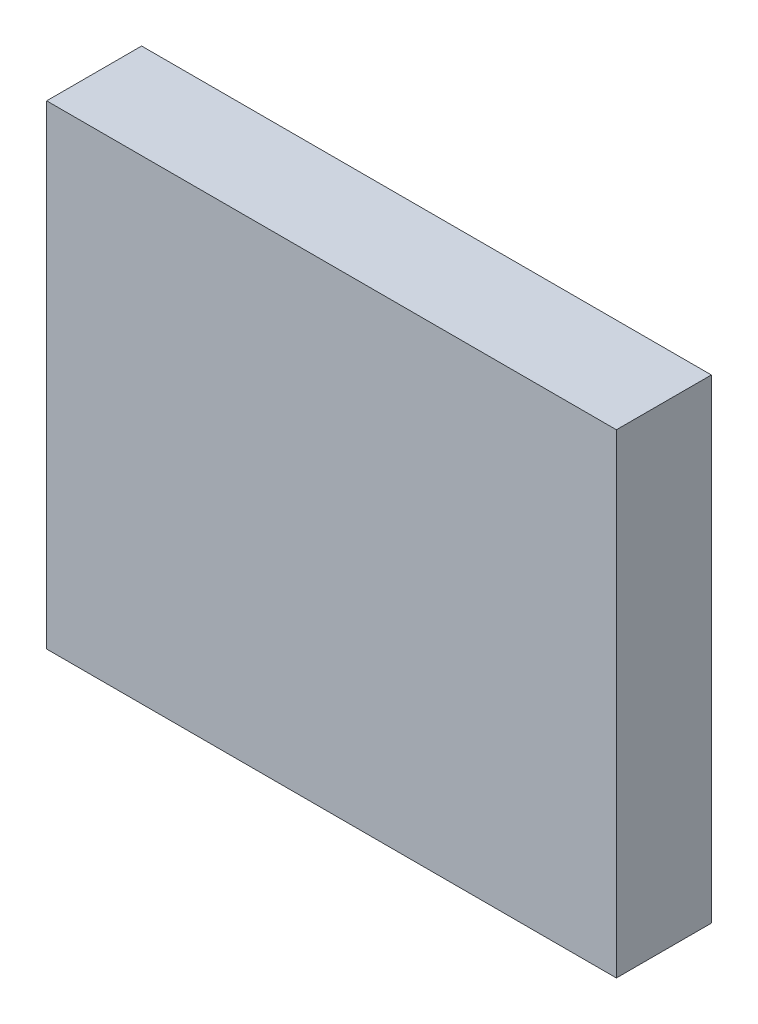
ISO-10303-21;
HEADER;
FILE_DESCRIPTION(('STEP AP214'),'2;1');
FILE_NAME('part.step','',(''),(''),'','','');
FILE_SCHEMA(('AUTOMOTIVE_DESIGN { 1 0 10303 214 1 1 1 1 }'));
ENDSEC;
DATA;
#1=APPLICATION_CONTEXT('core data for automotive mechanical design processes');
#2=APPLICATION_PROTOCOL_DEFINITION('international standard','automotive_design',2000,#1);
#3=PRODUCT_CONTEXT('',#1,'mechanical');
#4=PRODUCT('Part','Part','',(#3));
#5=PRODUCT_RELATED_PRODUCT_CATEGORY('part','',(#4));
#6=PRODUCT_DEFINITION_FORMATION('','',#4);
#7=PRODUCT_DEFINITION_CONTEXT('part definition',#1,'design');
#8=PRODUCT_DEFINITION('design','',#6,#7);
#9=PRODUCT_DEFINITION_SHAPE('','',#8);
#10=(LENGTH_UNIT() NAMED_UNIT(*) SI_UNIT(.MILLI.,.METRE.));
#11=(NAMED_UNIT(*) PLANE_ANGLE_UNIT() SI_UNIT($,.RADIAN.));
#12=(NAMED_UNIT(*) SI_UNIT($,.STERADIAN.) SOLID_ANGLE_UNIT());
#13=UNCERTAINTY_MEASURE_WITH_UNIT(LENGTH_MEASURE(1.E-05),#10,'distance_accuracy_value','');
#14=(GEOMETRIC_REPRESENTATION_CONTEXT(3) GLOBAL_UNCERTAINTY_ASSIGNED_CONTEXT((#13)) GLOBAL_UNIT_ASSIGNED_CONTEXT((#10,
#11,#12)) REPRESENTATION_CONTEXT('',''));
#15=CARTESIAN_POINT('',(0.,0.,0.));
#16=DIRECTION('',(0.,0.,1.));
#17=DIRECTION('',(1.,0.,0.));
#18=AXIS2_PLACEMENT_3D('',#15,#16,#17);
#19=CARTESIAN_POINT('',(-30.,-25.,10.));
#20=DIRECTION('',(1.,0.,0.));
#21=DIRECTION('',(0.,0.,-1.));
#22=AXIS2_PLACEMENT_3D('',#19,#20,#21);
#23=PLANE('',#22);
#24=DIRECTION('',(0.,-1.,0.));
#25=VECTOR('',#24,1.);
#26=CARTESIAN_POINT('',(-30.,-25.,0.));
#27=LINE('',#26,#25);
#28=CARTESIAN_POINT('',(-30.,25.,0.));
#29=VERTEX_POINT('',#28);
#30=CARTESIAN_POINT('',(-30.,-25.,0.));
#31=VERTEX_POINT('',#30);
#32=EDGE_CURVE('E96',#29,#31,#27,.T.);
#33=ORIENTED_EDGE('',*,*,#32,.T.);
#34=DIRECTION('',(0.,0.,-1.));
#35=VECTOR('',#34,1.);
#36=CARTESIAN_POINT('',(-30.,-25.,10.));
#37=LINE('',#36,#35);
#38=CARTESIAN_POINT('',(-30.,-25.,10.));
#39=VERTEX_POINT('',#38);
#40=EDGE_CURVE('E11',#39,#31,#37,.T.);
#41=ORIENTED_EDGE('',*,*,#40,.F.);
#42=DIRECTION('',(0.,-1.,0.));
#43=VECTOR('',#42,1.);
#44=CARTESIAN_POINT('',(-30.,-25.,10.));
#45=LINE('',#44,#43);
#46=CARTESIAN_POINT('',(-30.,25.,10.));
#47=VERTEX_POINT('',#46);
#48=EDGE_CURVE('E84',#47,#39,#45,.T.);
#49=ORIENTED_EDGE('',*,*,#48,.F.);
#50=DIRECTION('',(0.,0.,-1.));
#51=VECTOR('',#50,1.);
#52=CARTESIAN_POINT('',(-30.,25.,10.));
#53=LINE('',#52,#51);
#54=EDGE_CURVE('E92',#47,#29,#53,.T.);
#55=ORIENTED_EDGE('',*,*,#54,.T.);
#56=EDGE_LOOP('',(#33,#41,#49,#55));
#57=FACE_BOUND('',#56,.T.);
#58=ADVANCED_FACE('F33',(#57),#23,.F.);
#59=CARTESIAN_POINT('',(30.,-25.,10.));
#60=DIRECTION('',(0.,1.,0.));
#61=DIRECTION('',(-1.,0.,0.));
#62=AXIS2_PLACEMENT_3D('',#59,#60,#61);
#63=PLANE('',#62);
#64=DIRECTION('',(1.,0.,0.));
#65=VECTOR('',#64,1.);
#66=CARTESIAN_POINT('',(30.,-25.,0.));
#67=LINE('',#66,#65);
#68=CARTESIAN_POINT('',(30.,-25.,0.));
#69=VERTEX_POINT('',#68);
#70=EDGE_CURVE('E88',#31,#69,#67,.T.);
#71=ORIENTED_EDGE('',*,*,#70,.T.);
#72=DIRECTION('',(0.,0.,-1.));
#73=VECTOR('',#72,1.);
#74=CARTESIAN_POINT('',(30.,-25.,10.));
#75=LINE('',#74,#73);
#76=CARTESIAN_POINT('',(30.,-25.,10.));
#77=VERTEX_POINT('',#76);
#78=EDGE_CURVE('E41',#77,#69,#75,.T.);
#79=ORIENTED_EDGE('',*,*,#78,.F.);
#80=DIRECTION('',(1.,0.,0.));
#81=VECTOR('',#80,1.);
#82=CARTESIAN_POINT('',(30.,-25.,10.));
#83=LINE('',#82,#81);
#84=EDGE_CURVE('E79',#39,#77,#83,.T.);
#85=ORIENTED_EDGE('',*,*,#84,.F.);
#86=ORIENTED_EDGE('',*,*,#40,.T.);
#87=EDGE_LOOP('',(#71,#79,#85,#86));
#88=FACE_BOUND('',#87,.T.);
#89=ADVANCED_FACE('F87',(#88),#63,.F.);
#90=CARTESIAN_POINT('',(30.,-25.,10.));
#91=DIRECTION('',(-1.,0.,0.));
#92=DIRECTION('',(0.,0.,1.));
#93=AXIS2_PLACEMENT_3D('',#90,#91,#92);
#94=PLANE('',#93);
#95=DIRECTION('',(0.,1.,0.));
#96=VECTOR('',#95,1.);
#97=CARTESIAN_POINT('',(30.,-25.,0.));
#98=LINE('',#97,#96);
#99=CARTESIAN_POINT('',(30.,25.,0.));
#100=VERTEX_POINT('',#99);
#101=EDGE_CURVE('E66',#69,#100,#98,.T.);
#102=ORIENTED_EDGE('',*,*,#101,.T.);
#103=DIRECTION('',(0.,0.,-1.));
#104=VECTOR('',#103,1.);
#105=CARTESIAN_POINT('',(30.,25.,10.));
#106=LINE('',#105,#104);
#107=CARTESIAN_POINT('',(30.,25.,10.));
#108=VERTEX_POINT('',#107);
#109=EDGE_CURVE('E89',#108,#100,#106,.T.);
#110=ORIENTED_EDGE('',*,*,#109,.F.);
#111=DIRECTION('',(0.,1.,0.));
#112=VECTOR('',#111,1.);
#113=CARTESIAN_POINT('',(30.,-25.,10.));
#114=LINE('',#113,#112);
#115=EDGE_CURVE('E82',#77,#108,#114,.T.);
#116=ORIENTED_EDGE('',*,*,#115,.F.);
#117=ORIENTED_EDGE('',*,*,#78,.T.);
#118=EDGE_LOOP('',(#102,#110,#116,#117));
#119=FACE_BOUND('',#118,.T.);
#120=ADVANCED_FACE('F90',(#119),#94,.F.);
#121=CARTESIAN_POINT('',(30.,25.,10.));
#122=DIRECTION('',(0.,-1.,0.));
#123=DIRECTION('',(1.,0.,0.));
#124=AXIS2_PLACEMENT_3D('',#121,#122,#123);
#125=PLANE('',#124);
#126=DIRECTION('',(-1.,0.,0.));
#127=VECTOR('',#126,1.);
#128=CARTESIAN_POINT('',(30.,25.,0.));
#129=LINE('',#128,#127);
#130=EDGE_CURVE('E72',#100,#29,#129,.T.);
#131=ORIENTED_EDGE('',*,*,#130,.T.);
#132=ORIENTED_EDGE('',*,*,#54,.F.);
#133=DIRECTION('',(-1.,0.,0.));
#134=VECTOR('',#133,1.);
#135=CARTESIAN_POINT('',(30.,25.,10.));
#136=LINE('',#135,#134);
#137=EDGE_CURVE('E49',#108,#47,#136,.T.);
#138=ORIENTED_EDGE('',*,*,#137,.F.);
#139=ORIENTED_EDGE('',*,*,#109,.T.);
#140=EDGE_LOOP('',(#131,#132,#138,#139));
#141=FACE_BOUND('',#140,.T.);
#142=ADVANCED_FACE('F103',(#141),#125,.F.);
#143=CARTESIAN_POINT('',(0.,0.,10.));
#144=DIRECTION('',(0.,0.,1.));
#145=DIRECTION('',(1.,0.,0.));
#146=AXIS2_PLACEMENT_3D('',#143,#144,#145);
#147=PLANE('',#146);
#148=ORIENTED_EDGE('',*,*,#48,.T.);
#149=ORIENTED_EDGE('',*,*,#84,.T.);
#150=ORIENTED_EDGE('',*,*,#115,.T.);
#151=ORIENTED_EDGE('',*,*,#137,.T.);
#152=EDGE_LOOP('',(#148,#149,#150,#151));
#153=FACE_BOUND('',#152,.T.);
#154=ADVANCED_FACE('F80',(#153),#147,.T.);
#155=CARTESIAN_POINT('',(0.,0.,0.));
#156=DIRECTION('',(0.,0.,1.));
#157=DIRECTION('',(1.,0.,0.));
#158=AXIS2_PLACEMENT_3D('',#155,#156,#157);
#159=PLANE('',#158);
#160=ORIENTED_EDGE('',*,*,#32,.F.);
#161=ORIENTED_EDGE('',*,*,#130,.F.);
#162=ORIENTED_EDGE('',*,*,#101,.F.);
#163=ORIENTED_EDGE('',*,*,#70,.F.);
#164=EDGE_LOOP('',(#160,#161,#162,#163));
#165=FACE_BOUND('',#164,.T.);
#166=ADVANCED_FACE('F106',(#165),#159,.F.);
#167=CLOSED_SHELL('',(#58,#89,#120,#142,#154,#166));
#168=MANIFOLD_SOLID_BREP('B2',#167);
#169=ADVANCED_BREP_SHAPE_REPRESENTATION('',(#18,#168),#14);
#170=SHAPE_DEFINITION_REPRESENTATION(#9,#169);
ENDSEC;
END-ISO-10303-21;
